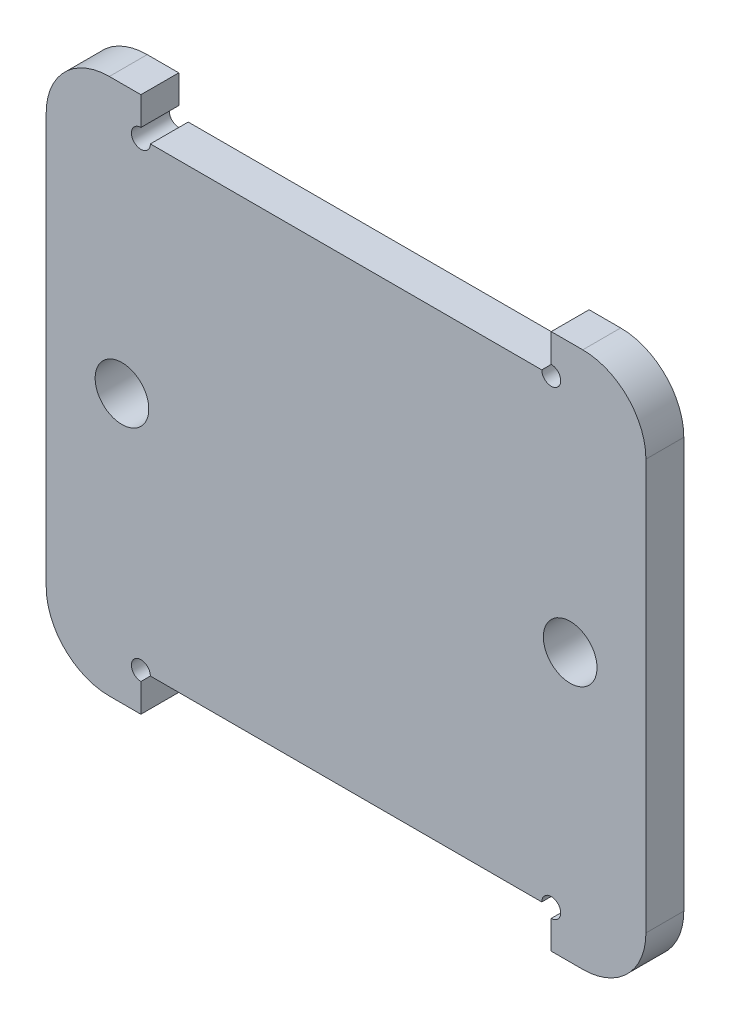
ISO-10303-21;
HEADER;
FILE_DESCRIPTION(('STEP AP214'),'2;1');
FILE_NAME('part.step','',(''),(''),'','','');
FILE_SCHEMA(('AUTOMOTIVE_DESIGN { 1 0 10303 214 1 1 1 1 }'));
ENDSEC;
DATA;
#1=APPLICATION_CONTEXT('core data for automotive mechanical design processes');
#2=APPLICATION_PROTOCOL_DEFINITION('international standard','automotive_design',2000,#1);
#3=PRODUCT_CONTEXT('',#1,'mechanical');
#4=PRODUCT('Part','Part','',(#3));
#5=PRODUCT_RELATED_PRODUCT_CATEGORY('part','',(#4));
#6=PRODUCT_DEFINITION_FORMATION('','',#4);
#7=PRODUCT_DEFINITION_CONTEXT('part definition',#1,'design');
#8=PRODUCT_DEFINITION('design','',#6,#7);
#9=PRODUCT_DEFINITION_SHAPE('','',#8);
#10=(LENGTH_UNIT() NAMED_UNIT(*) SI_UNIT(.MILLI.,.METRE.));
#11=(NAMED_UNIT(*) PLANE_ANGLE_UNIT() SI_UNIT($,.RADIAN.));
#12=(NAMED_UNIT(*) SI_UNIT($,.STERADIAN.) SOLID_ANGLE_UNIT());
#13=UNCERTAINTY_MEASURE_WITH_UNIT(LENGTH_MEASURE(1.E-05),#10,'distance_accuracy_value','');
#14=(GEOMETRIC_REPRESENTATION_CONTEXT(3) GLOBAL_UNCERTAINTY_ASSIGNED_CONTEXT((#13)) GLOBAL_UNIT_ASSIGNED_CONTEXT((#10,
#11,#12)) REPRESENTATION_CONTEXT('',''));
#15=CARTESIAN_POINT('',(0.,0.,0.));
#16=DIRECTION('',(0.,0.,1.));
#17=DIRECTION('',(1.,0.,0.));
#18=AXIS2_PLACEMENT_3D('',#15,#16,#17);
#19=CARTESIAN_POINT('',(-314.,95.,6.));
#20=DIRECTION('',(0.,0.,-1.));
#21=DIRECTION('',(-1.,0.,0.));
#22=AXIS2_PLACEMENT_3D('',#19,#20,#21);
#23=PLANE('',#22);
#24=DIRECTION('',(1.,0.,0.));
#25=VECTOR('',#24,1.);
#26=CARTESIAN_POINT('',(-319.,26.,6.));
#27=LINE('',#26,#25);
#28=CARTESIAN_POINT('',(-382.5,26.,6.));
#29=VERTEX_POINT('',#28);
#30=CARTESIAN_POINT('',(-320.5,26.,6.));
#31=VERTEX_POINT('',#30);
#32=EDGE_CURVE('E190',#29,#31,#27,.T.);
#33=ORIENTED_EDGE('',*,*,#32,.T.);
#34=CARTESIAN_POINT('',(-319.,26.,6.));
#35=DIRECTION('',(0.,0.,1.));
#36=DIRECTION('',(-1.,0.,0.));
#37=AXIS2_PLACEMENT_3D('',#34,#35,#36);
#38=CIRCLE('',#37,1.50000000000002);
#39=CARTESIAN_POINT('',(-319.,24.5,6.));
#40=VERTEX_POINT('',#39);
#41=EDGE_CURVE('E172',#40,#31,#38,.T.);
#42=ORIENTED_EDGE('',*,*,#41,.F.);
#43=DIRECTION('',(0.,-1.,0.));
#44=VECTOR('',#43,1.);
#45=CARTESIAN_POINT('',(-319.,20.,6.));
#46=LINE('',#45,#44);
#47=CARTESIAN_POINT('',(-319.,20.,6.));
#48=VERTEX_POINT('',#47);
#49=EDGE_CURVE('E202',#40,#48,#46,.T.);
#50=ORIENTED_EDGE('',*,*,#49,.T.);
#51=DIRECTION('',(1.,0.,0.));
#52=VECTOR('',#51,1.);
#53=CARTESIAN_POINT('',(-314.,20.,6.));
#54=LINE('',#53,#52);
#55=CARTESIAN_POINT('',(-314.,20.,6.));
#56=VERTEX_POINT('',#55);
#57=EDGE_CURVE('E208',#48,#56,#54,.T.);
#58=ORIENTED_EDGE('',*,*,#57,.T.);
#59=CARTESIAN_POINT('',(-314.,30.,6.));
#60=DIRECTION('',(0.,0.,1.));
#61=DIRECTION('',(-1.,0.,0.));
#62=AXIS2_PLACEMENT_3D('',#59,#60,#61);
#63=CIRCLE('',#62,10.);
#64=CARTESIAN_POINT('',(-304.,30.,6.));
#65=VERTEX_POINT('',#64);
#66=EDGE_CURVE('E217',#56,#65,#63,.T.);
#67=ORIENTED_EDGE('',*,*,#66,.T.);
#68=DIRECTION('',(0.,1.,0.));
#69=VECTOR('',#68,1.);
#70=CARTESIAN_POINT('',(-304.,95.,6.));
#71=LINE('',#70,#69);
#72=CARTESIAN_POINT('',(-304.,95.,6.));
#73=VERTEX_POINT('',#72);
#74=EDGE_CURVE('E220',#65,#73,#71,.T.);
#75=ORIENTED_EDGE('',*,*,#74,.T.);
#76=CARTESIAN_POINT('',(-314.,95.,6.));
#77=DIRECTION('',(0.,0.,1.));
#78=DIRECTION('',(-1.,0.,0.));
#79=AXIS2_PLACEMENT_3D('',#76,#77,#78);
#80=CIRCLE('',#79,10.);
#81=CARTESIAN_POINT('',(-314.,105.,6.));
#82=VERTEX_POINT('',#81);
#83=EDGE_CURVE('E223',#73,#82,#80,.T.);
#84=ORIENTED_EDGE('',*,*,#83,.T.);
#85=DIRECTION('',(-1.,0.,0.));
#86=VECTOR('',#85,1.);
#87=CARTESIAN_POINT('',(-319.,105.,6.));
#88=LINE('',#87,#86);
#89=CARTESIAN_POINT('',(-319.,105.,6.));
#90=VERTEX_POINT('',#89);
#91=EDGE_CURVE('E226',#82,#90,#88,.T.);
#92=ORIENTED_EDGE('',*,*,#91,.T.);
#93=DIRECTION('',(0.,-1.,0.));
#94=VECTOR('',#93,1.);
#95=CARTESIAN_POINT('',(-319.,99.,6.));
#96=LINE('',#95,#94);
#97=CARTESIAN_POINT('',(-319.,100.5,6.));
#98=VERTEX_POINT('',#97);
#99=EDGE_CURVE('E281',#90,#98,#96,.T.);
#100=ORIENTED_EDGE('',*,*,#99,.T.);
#101=CARTESIAN_POINT('',(-319.,99.,6.));
#102=DIRECTION('',(0.,0.,1.));
#103=DIRECTION('',(1.,0.,0.));
#104=AXIS2_PLACEMENT_3D('',#101,#102,#103);
#105=CIRCLE('',#104,1.50000000000002);
#106=CARTESIAN_POINT('',(-320.5,99.,6.));
#107=VERTEX_POINT('',#106);
#108=EDGE_CURVE('E425',#107,#98,#105,.T.);
#109=ORIENTED_EDGE('',*,*,#108,.F.);
#110=DIRECTION('',(-1.,0.,0.));
#111=VECTOR('',#110,1.);
#112=CARTESIAN_POINT('',(-384.,99.,6.));
#113=LINE('',#112,#111);
#114=CARTESIAN_POINT('',(-382.5,99.,6.));
#115=VERTEX_POINT('',#114);
#116=EDGE_CURVE('E413',#107,#115,#113,.T.);
#117=ORIENTED_EDGE('',*,*,#116,.T.);
#118=CARTESIAN_POINT('',(-384.,99.,6.));
#119=DIRECTION('',(0.,0.,1.));
#120=DIRECTION('',(-1.,0.,0.));
#121=AXIS2_PLACEMENT_3D('',#118,#119,#120);
#122=CIRCLE('',#121,1.50000000000002);
#123=CARTESIAN_POINT('',(-384.,100.5,6.));
#124=VERTEX_POINT('',#123);
#125=EDGE_CURVE('E417',#124,#115,#122,.T.);
#126=ORIENTED_EDGE('',*,*,#125,.F.);
#127=DIRECTION('',(0.,1.,0.));
#128=VECTOR('',#127,1.);
#129=CARTESIAN_POINT('',(-384.,99.,6.));
#130=LINE('',#129,#128);
#131=CARTESIAN_POINT('',(-384.,105.,6.));
#132=VERTEX_POINT('',#131);
#133=EDGE_CURVE('E340',#124,#132,#130,.T.);
#134=ORIENTED_EDGE('',*,*,#133,.T.);
#135=DIRECTION('',(-1.,0.,0.));
#136=VECTOR('',#135,1.);
#137=CARTESIAN_POINT('',(-384.,105.,6.));
#138=LINE('',#137,#136);
#139=CARTESIAN_POINT('',(-389.,105.,6.));
#140=VERTEX_POINT('',#139);
#141=EDGE_CURVE('E361',#132,#140,#138,.T.);
#142=ORIENTED_EDGE('',*,*,#141,.T.);
#143=CARTESIAN_POINT('',(-389.,95.,6.));
#144=DIRECTION('',(0.,0.,1.));
#145=DIRECTION('',(1.,0.,0.));
#146=AXIS2_PLACEMENT_3D('',#143,#144,#145);
#147=CIRCLE('',#146,10.);
#148=CARTESIAN_POINT('',(-399.,95.,6.));
#149=VERTEX_POINT('',#148);
#150=EDGE_CURVE('E357',#140,#149,#147,.T.);
#151=ORIENTED_EDGE('',*,*,#150,.T.);
#152=DIRECTION('',(0.,-1.,0.));
#153=VECTOR('',#152,1.);
#154=CARTESIAN_POINT('',(-399.,95.,6.));
#155=LINE('',#154,#153);
#156=CARTESIAN_POINT('',(-399.,30.,6.));
#157=VERTEX_POINT('',#156);
#158=EDGE_CURVE('E360',#149,#157,#155,.T.);
#159=ORIENTED_EDGE('',*,*,#158,.T.);
#160=CARTESIAN_POINT('',(-389.,30.,6.));
#161=DIRECTION('',(0.,0.,1.));
#162=DIRECTION('',(1.,0.,0.));
#163=AXIS2_PLACEMENT_3D('',#160,#161,#162);
#164=CIRCLE('',#163,10.);
#165=CARTESIAN_POINT('',(-389.,19.9999999999999,6.));
#166=VERTEX_POINT('',#165);
#167=EDGE_CURVE('E364',#157,#166,#164,.T.);
#168=ORIENTED_EDGE('',*,*,#167,.T.);
#169=DIRECTION('',(1.,0.,0.));
#170=VECTOR('',#169,1.);
#171=CARTESIAN_POINT('',(-389.,20.,6.));
#172=LINE('',#171,#170);
#173=CARTESIAN_POINT('',(-384.,20.,6.));
#174=VERTEX_POINT('',#173);
#175=EDGE_CURVE('E211',#166,#174,#172,.T.);
#176=ORIENTED_EDGE('',*,*,#175,.T.);
#177=DIRECTION('',(0.,1.,0.));
#178=VECTOR('',#177,1.);
#179=CARTESIAN_POINT('',(-384.,20.,6.));
#180=LINE('',#179,#178);
#181=CARTESIAN_POINT('',(-384.,24.5,6.));
#182=VERTEX_POINT('',#181);
#183=EDGE_CURVE('E203',#174,#182,#180,.T.);
#184=ORIENTED_EDGE('',*,*,#183,.T.);
#185=CARTESIAN_POINT('',(-384.,26.,6.));
#186=DIRECTION('',(0.,0.,1.));
#187=DIRECTION('',(1.,0.,0.));
#188=AXIS2_PLACEMENT_3D('',#185,#186,#187);
#189=CIRCLE('',#188,1.50000000000002);
#190=EDGE_CURVE('E200',#29,#182,#189,.T.);
#191=ORIENTED_EDGE('',*,*,#190,.F.);
#192=EDGE_LOOP('',(#33,#42,#50,#58,#67,#75,#84,#92,#100,#109,#117,#126,#134,#142,#151,#159,#168,
#176,#184,#191));
#193=FACE_BOUND('',#192,.T.);
#194=CARTESIAN_POINT('',(-316.,62.5,6.));
#195=DIRECTION('',(0.,0.,1.));
#196=DIRECTION('',(1.,0.,0.));
#197=AXIS2_PLACEMENT_3D('',#194,#195,#196);
#198=CIRCLE('',#197,4.24999999999995);
#199=CARTESIAN_POINT('',(-311.75,62.5,6.));
#200=VERTEX_POINT('',#199);
#201=EDGE_CURVE('E235',#200,#200,#198,.T.);
#202=ORIENTED_EDGE('',*,*,#201,.F.);
#203=EDGE_LOOP('',(#202));
#204=FACE_BOUND('',#203,.T.);
#205=CARTESIAN_POINT('',(-387.,62.5,6.));
#206=DIRECTION('',(0.,0.,1.));
#207=DIRECTION('',(-1.,0.,0.));
#208=AXIS2_PLACEMENT_3D('',#205,#206,#207);
#209=CIRCLE('',#208,4.24999999999995);
#210=CARTESIAN_POINT('',(-391.25,62.5,6.));
#211=VERTEX_POINT('',#210);
#212=EDGE_CURVE('E398',#211,#211,#209,.T.);
#213=ORIENTED_EDGE('',*,*,#212,.F.);
#214=EDGE_LOOP('',(#213));
#215=FACE_BOUND('',#214,.T.);
#216=ADVANCED_FACE('F36',(#193,#204,#215),#23,.F.);
#217=CARTESIAN_POINT('',(-314.,95.,0.));
#218=DIRECTION('',(0.,0.,-1.));
#219=DIRECTION('',(-1.,0.,0.));
#220=AXIS2_PLACEMENT_3D('',#217,#218,#219);
#221=PLANE('',#220);
#222=CARTESIAN_POINT('',(-319.,26.,0.));
#223=DIRECTION('',(0.,0.,1.));
#224=DIRECTION('',(-1.,0.,0.));
#225=AXIS2_PLACEMENT_3D('',#222,#223,#224);
#226=CIRCLE('',#225,1.50000000000002);
#227=CARTESIAN_POINT('',(-319.,24.5,0.));
#228=VERTEX_POINT('',#227);
#229=CARTESIAN_POINT('',(-320.5,26.,0.));
#230=VERTEX_POINT('',#229);
#231=EDGE_CURVE('E183',#228,#230,#226,.T.);
#232=ORIENTED_EDGE('',*,*,#231,.T.);
#233=DIRECTION('',(1.,0.,0.));
#234=VECTOR('',#233,1.);
#235=CARTESIAN_POINT('',(-319.,26.,0.));
#236=LINE('',#235,#234);
#237=CARTESIAN_POINT('',(-382.5,26.,0.));
#238=VERTEX_POINT('',#237);
#239=EDGE_CURVE('E192',#238,#230,#236,.T.);
#240=ORIENTED_EDGE('',*,*,#239,.F.);
#241=CARTESIAN_POINT('',(-384.,26.,0.));
#242=DIRECTION('',(0.,0.,1.));
#243=DIRECTION('',(1.,0.,0.));
#244=AXIS2_PLACEMENT_3D('',#241,#242,#243);
#245=CIRCLE('',#244,1.50000000000002);
#246=CARTESIAN_POINT('',(-384.,24.5,0.));
#247=VERTEX_POINT('',#246);
#248=EDGE_CURVE('E195',#238,#247,#245,.T.);
#249=ORIENTED_EDGE('',*,*,#248,.T.);
#250=DIRECTION('',(0.,1.,0.));
#251=VECTOR('',#250,1.);
#252=CARTESIAN_POINT('',(-384.,20.,0.));
#253=LINE('',#252,#251);
#254=CARTESIAN_POINT('',(-384.,20.,0.));
#255=VERTEX_POINT('',#254);
#256=EDGE_CURVE('E257',#255,#247,#253,.T.);
#257=ORIENTED_EDGE('',*,*,#256,.F.);
#258=DIRECTION('',(1.,0.,0.));
#259=VECTOR('',#258,1.);
#260=CARTESIAN_POINT('',(-389.,20.,0.));
#261=LINE('',#260,#259);
#262=CARTESIAN_POINT('',(-389.,19.9999999999999,0.));
#263=VERTEX_POINT('',#262);
#264=EDGE_CURVE('E254',#263,#255,#261,.T.);
#265=ORIENTED_EDGE('',*,*,#264,.F.);
#266=CARTESIAN_POINT('',(-389.,30.,0.));
#267=DIRECTION('',(0.,0.,1.));
#268=DIRECTION('',(1.,0.,0.));
#269=AXIS2_PLACEMENT_3D('',#266,#267,#268);
#270=CIRCLE('',#269,10.);
#271=CARTESIAN_POINT('',(-399.,30.,0.));
#272=VERTEX_POINT('',#271);
#273=EDGE_CURVE('E251',#272,#263,#270,.T.);
#274=ORIENTED_EDGE('',*,*,#273,.F.);
#275=DIRECTION('',(0.,-1.,0.));
#276=VECTOR('',#275,1.);
#277=CARTESIAN_POINT('',(-399.,95.,0.));
#278=LINE('',#277,#276);
#279=CARTESIAN_POINT('',(-399.,95.,0.));
#280=VERTEX_POINT('',#279);
#281=EDGE_CURVE('E248',#280,#272,#278,.T.);
#282=ORIENTED_EDGE('',*,*,#281,.F.);
#283=CARTESIAN_POINT('',(-389.,95.,0.));
#284=DIRECTION('',(0.,0.,1.));
#285=DIRECTION('',(1.,0.,0.));
#286=AXIS2_PLACEMENT_3D('',#283,#284,#285);
#287=CIRCLE('',#286,10.);
#288=CARTESIAN_POINT('',(-389.,105.,0.));
#289=VERTEX_POINT('',#288);
#290=EDGE_CURVE('E245',#289,#280,#287,.T.);
#291=ORIENTED_EDGE('',*,*,#290,.F.);
#292=DIRECTION('',(-1.,0.,0.));
#293=VECTOR('',#292,1.);
#294=CARTESIAN_POINT('',(-384.,105.,0.));
#295=LINE('',#294,#293);
#296=CARTESIAN_POINT('',(-384.,105.,0.));
#297=VERTEX_POINT('',#296);
#298=EDGE_CURVE('E242',#297,#289,#295,.T.);
#299=ORIENTED_EDGE('',*,*,#298,.F.);
#300=DIRECTION('',(0.,1.,0.));
#301=VECTOR('',#300,1.);
#302=CARTESIAN_POINT('',(-384.,99.,0.));
#303=LINE('',#302,#301);
#304=CARTESIAN_POINT('',(-384.,100.5,0.));
#305=VERTEX_POINT('',#304);
#306=EDGE_CURVE('E239',#305,#297,#303,.T.);
#307=ORIENTED_EDGE('',*,*,#306,.F.);
#308=CARTESIAN_POINT('',(-384.,99.,0.));
#309=DIRECTION('',(0.,0.,1.));
#310=DIRECTION('',(-1.,0.,0.));
#311=AXIS2_PLACEMENT_3D('',#308,#309,#310);
#312=CIRCLE('',#311,1.50000000000002);
#313=CARTESIAN_POINT('',(-382.5,99.,0.));
#314=VERTEX_POINT('',#313);
#315=EDGE_CURVE('E59',#305,#314,#312,.T.);
#316=ORIENTED_EDGE('',*,*,#315,.T.);
#317=DIRECTION('',(-1.,0.,0.));
#318=VECTOR('',#317,1.);
#319=CARTESIAN_POINT('',(-384.,99.,0.));
#320=LINE('',#319,#318);
#321=CARTESIAN_POINT('',(-320.5,99.,0.));
#322=VERTEX_POINT('',#321);
#323=EDGE_CURVE('E234',#322,#314,#320,.T.);
#324=ORIENTED_EDGE('',*,*,#323,.F.);
#325=CARTESIAN_POINT('',(-319.,99.,0.));
#326=DIRECTION('',(0.,0.,1.));
#327=DIRECTION('',(1.,0.,0.));
#328=AXIS2_PLACEMENT_3D('',#325,#326,#327);
#329=CIRCLE('',#328,1.50000000000002);
#330=CARTESIAN_POINT('',(-319.,100.5,0.));
#331=VERTEX_POINT('',#330);
#332=EDGE_CURVE('E52',#322,#331,#329,.T.);
#333=ORIENTED_EDGE('',*,*,#332,.T.);
#334=DIRECTION('',(0.,-1.,0.));
#335=VECTOR('',#334,1.);
#336=CARTESIAN_POINT('',(-319.,99.,0.));
#337=LINE('',#336,#335);
#338=CARTESIAN_POINT('',(-319.,105.,0.));
#339=VERTEX_POINT('',#338);
#340=EDGE_CURVE('E230',#339,#331,#337,.T.);
#341=ORIENTED_EDGE('',*,*,#340,.F.);
#342=DIRECTION('',(-1.,0.,0.));
#343=VECTOR('',#342,1.);
#344=CARTESIAN_POINT('',(-319.,105.,0.));
#345=LINE('',#344,#343);
#346=CARTESIAN_POINT('',(-314.,105.,0.));
#347=VERTEX_POINT('',#346);
#348=EDGE_CURVE('E278',#347,#339,#345,.T.);
#349=ORIENTED_EDGE('',*,*,#348,.F.);
#350=CARTESIAN_POINT('',(-314.,95.,0.));
#351=DIRECTION('',(0.,0.,1.));
#352=DIRECTION('',(-1.,0.,0.));
#353=AXIS2_PLACEMENT_3D('',#350,#351,#352);
#354=CIRCLE('',#353,10.);
#355=CARTESIAN_POINT('',(-304.,95.,0.));
#356=VERTEX_POINT('',#355);
#357=EDGE_CURVE('E275',#356,#347,#354,.T.);
#358=ORIENTED_EDGE('',*,*,#357,.F.);
#359=DIRECTION('',(0.,1.,0.));
#360=VECTOR('',#359,1.);
#361=CARTESIAN_POINT('',(-304.,95.,0.));
#362=LINE('',#361,#360);
#363=CARTESIAN_POINT('',(-304.,30.,0.));
#364=VERTEX_POINT('',#363);
#365=EDGE_CURVE('E272',#364,#356,#362,.T.);
#366=ORIENTED_EDGE('',*,*,#365,.F.);
#367=CARTESIAN_POINT('',(-314.,30.,0.));
#368=DIRECTION('',(0.,0.,1.));
#369=DIRECTION('',(-1.,0.,0.));
#370=AXIS2_PLACEMENT_3D('',#367,#368,#369);
#371=CIRCLE('',#370,10.);
#372=CARTESIAN_POINT('',(-314.,20.,0.));
#373=VERTEX_POINT('',#372);
#374=EDGE_CURVE('E269',#373,#364,#371,.T.);
#375=ORIENTED_EDGE('',*,*,#374,.F.);
#376=DIRECTION('',(1.,0.,0.));
#377=VECTOR('',#376,1.);
#378=CARTESIAN_POINT('',(-314.,20.,0.));
#379=LINE('',#378,#377);
#380=CARTESIAN_POINT('',(-319.,20.,0.));
#381=VERTEX_POINT('',#380);
#382=EDGE_CURVE('E266',#381,#373,#379,.T.);
#383=ORIENTED_EDGE('',*,*,#382,.F.);
#384=DIRECTION('',(0.,-1.,0.));
#385=VECTOR('',#384,1.);
#386=CARTESIAN_POINT('',(-319.,20.,0.));
#387=LINE('',#386,#385);
#388=EDGE_CURVE('E263',#228,#381,#387,.T.);
#389=ORIENTED_EDGE('',*,*,#388,.F.);
#390=EDGE_LOOP('',(#232,#240,#249,#257,#265,#274,#282,#291,#299,#307,#316,#324,#333,#341,#349,
#358,#366,#375,#383,#389));
#391=FACE_BOUND('',#390,.T.);
#392=CARTESIAN_POINT('',(-316.,62.5,0.));
#393=DIRECTION('',(0.,0.,1.));
#394=DIRECTION('',(1.,0.,0.));
#395=AXIS2_PLACEMENT_3D('',#392,#393,#394);
#396=CIRCLE('',#395,4.24999999999995);
#397=CARTESIAN_POINT('',(-311.75,62.5,0.));
#398=VERTEX_POINT('',#397);
#399=EDGE_CURVE('E401',#398,#398,#396,.T.);
#400=ORIENTED_EDGE('',*,*,#399,.T.);
#401=EDGE_LOOP('',(#400));
#402=FACE_BOUND('',#401,.T.);
#403=CARTESIAN_POINT('',(-387.,62.5,0.));
#404=DIRECTION('',(0.,0.,1.));
#405=DIRECTION('',(-1.,0.,0.));
#406=AXIS2_PLACEMENT_3D('',#403,#404,#405);
#407=CIRCLE('',#406,4.24999999999995);
#408=CARTESIAN_POINT('',(-391.25,62.5,0.));
#409=VERTEX_POINT('',#408);
#410=EDGE_CURVE('E397',#409,#409,#407,.T.);
#411=ORIENTED_EDGE('',*,*,#410,.T.);
#412=EDGE_LOOP('',(#411));
#413=FACE_BOUND('',#412,.T.);
#414=ADVANCED_FACE('F344',(#391,#402,#413),#221,.T.);
#415=CARTESIAN_POINT('',(-319.,99.,6.));
#416=DIRECTION('',(1.,0.,0.));
#417=DIRECTION('',(0.,0.,-1.));
#418=AXIS2_PLACEMENT_3D('',#415,#416,#417);
#419=PLANE('',#418);
#420=ORIENTED_EDGE('',*,*,#340,.T.);
#421=DIRECTION('',(0.,0.,1.));
#422=VECTOR('',#421,1.);
#423=CARTESIAN_POINT('',(-319.,100.5,0.));
#424=LINE('',#423,#422);
#425=EDGE_CURVE('E391',#331,#98,#424,.T.);
#426=ORIENTED_EDGE('',*,*,#425,.T.);
#427=ORIENTED_EDGE('',*,*,#99,.F.);
#428=DIRECTION('',(0.,0.,-1.));
#429=VECTOR('',#428,1.);
#430=CARTESIAN_POINT('',(-319.,105.,6.));
#431=LINE('',#430,#429);
#432=EDGE_CURVE('E229',#90,#339,#431,.T.);
#433=ORIENTED_EDGE('',*,*,#432,.T.);
#434=EDGE_LOOP('',(#420,#426,#427,#433));
#435=FACE_BOUND('',#434,.T.);
#436=ADVANCED_FACE('F38',(#435),#419,.F.);
#437=CARTESIAN_POINT('',(-384.,99.,6.));
#438=DIRECTION('',(0.,-1.,0.));
#439=DIRECTION('',(0.,0.,-1.));
#440=AXIS2_PLACEMENT_3D('',#437,#438,#439);
#441=PLANE('',#440);
#442=ORIENTED_EDGE('',*,*,#323,.T.);
#443=DIRECTION('',(0.,0.,1.));
#444=VECTOR('',#443,1.);
#445=CARTESIAN_POINT('',(-382.5,99.,0.));
#446=LINE('',#445,#444);
#447=EDGE_CURVE('E388',#314,#115,#446,.T.);
#448=ORIENTED_EDGE('',*,*,#447,.T.);
#449=ORIENTED_EDGE('',*,*,#116,.F.);
#450=DIRECTION('',(0.,0.,1.));
#451=VECTOR('',#450,1.);
#452=CARTESIAN_POINT('',(-320.5,99.,0.));
#453=LINE('',#452,#451);
#454=EDGE_CURVE('E11',#107,#322,#453,.F.);
#455=ORIENTED_EDGE('',*,*,#454,.T.);
#456=EDGE_LOOP('',(#442,#448,#449,#455));
#457=FACE_BOUND('',#456,.T.);
#458=ADVANCED_FACE('F448',(#457),#441,.F.);
#459=CARTESIAN_POINT('',(-384.,99.,6.));
#460=DIRECTION('',(-1.,0.,0.));
#461=DIRECTION('',(0.,0.,1.));
#462=AXIS2_PLACEMENT_3D('',#459,#460,#461);
#463=PLANE('',#462);
#464=ORIENTED_EDGE('',*,*,#133,.F.);
#465=DIRECTION('',(0.,0.,1.));
#466=VECTOR('',#465,1.);
#467=CARTESIAN_POINT('',(-384.,100.5,0.));
#468=LINE('',#467,#466);
#469=EDGE_CURVE('E45',#124,#305,#468,.F.);
#470=ORIENTED_EDGE('',*,*,#469,.T.);
#471=ORIENTED_EDGE('',*,*,#306,.T.);
#472=DIRECTION('',(0.,0.,-1.));
#473=VECTOR('',#472,1.);
#474=CARTESIAN_POINT('',(-384.,105.,6.));
#475=LINE('',#474,#473);
#476=EDGE_CURVE('E324',#132,#297,#475,.T.);
#477=ORIENTED_EDGE('',*,*,#476,.F.);
#478=EDGE_LOOP('',(#464,#470,#471,#477));
#479=FACE_BOUND('',#478,.T.);
#480=ADVANCED_FACE('F338',(#479),#463,.F.);
#481=CARTESIAN_POINT('',(-384.,105.,6.));
#482=DIRECTION('',(0.,-1.,0.));
#483=DIRECTION('',(0.,0.,-1.));
#484=AXIS2_PLACEMENT_3D('',#481,#482,#483);
#485=PLANE('',#484);
#486=ORIENTED_EDGE('',*,*,#298,.T.);
#487=DIRECTION('',(0.,0.,-1.));
#488=VECTOR('',#487,1.);
#489=CARTESIAN_POINT('',(-389.,105.,6.));
#490=LINE('',#489,#488);
#491=EDGE_CURVE('E320',#140,#289,#490,.T.);
#492=ORIENTED_EDGE('',*,*,#491,.F.);
#493=ORIENTED_EDGE('',*,*,#141,.F.);
#494=ORIENTED_EDGE('',*,*,#476,.T.);
#495=EDGE_LOOP('',(#486,#492,#493,#494));
#496=FACE_BOUND('',#495,.T.);
#497=ADVANCED_FACE('F351',(#496),#485,.F.);
#498=CARTESIAN_POINT('',(-389.,95.,6.));
#499=DIRECTION('',(0.,0.,-1.));
#500=DIRECTION('',(-1.,0.,0.));
#501=AXIS2_PLACEMENT_3D('',#498,#499,#500);
#502=CYLINDRICAL_SURFACE('',#501,10.);
#503=ORIENTED_EDGE('',*,*,#290,.T.);
#504=DIRECTION('',(0.,0.,-1.));
#505=VECTOR('',#504,1.);
#506=CARTESIAN_POINT('',(-399.,95.,6.));
#507=LINE('',#506,#505);
#508=EDGE_CURVE('E316',#149,#280,#507,.T.);
#509=ORIENTED_EDGE('',*,*,#508,.F.);
#510=ORIENTED_EDGE('',*,*,#150,.F.);
#511=ORIENTED_EDGE('',*,*,#491,.T.);
#512=EDGE_LOOP('',(#503,#509,#510,#511));
#513=FACE_BOUND('',#512,.T.);
#514=ADVANCED_FACE('F355',(#513),#502,.T.);
#515=CARTESIAN_POINT('',(-399.,95.,6.));
#516=DIRECTION('',(1.,0.,0.));
#517=DIRECTION('',(0.,0.,-1.));
#518=AXIS2_PLACEMENT_3D('',#515,#516,#517);
#519=PLANE('',#518);
#520=ORIENTED_EDGE('',*,*,#281,.T.);
#521=DIRECTION('',(0.,0.,-1.));
#522=VECTOR('',#521,1.);
#523=CARTESIAN_POINT('',(-399.,30.,6.));
#524=LINE('',#523,#522);
#525=EDGE_CURVE('E312',#157,#272,#524,.T.);
#526=ORIENTED_EDGE('',*,*,#525,.F.);
#527=ORIENTED_EDGE('',*,*,#158,.F.);
#528=ORIENTED_EDGE('',*,*,#508,.T.);
#529=EDGE_LOOP('',(#520,#526,#527,#528));
#530=FACE_BOUND('',#529,.T.);
#531=ADVANCED_FACE('F501',(#530),#519,.F.);
#532=CARTESIAN_POINT('',(-389.,30.,6.));
#533=DIRECTION('',(0.,0.,-1.));
#534=DIRECTION('',(-1.,0.,0.));
#535=AXIS2_PLACEMENT_3D('',#532,#533,#534);
#536=CYLINDRICAL_SURFACE('',#535,10.);
#537=ORIENTED_EDGE('',*,*,#273,.T.);
#538=DIRECTION('',(0.,0.,-1.));
#539=VECTOR('',#538,1.);
#540=CARTESIAN_POINT('',(-389.,19.9999999999999,6.));
#541=LINE('',#540,#539);
#542=EDGE_CURVE('E308',#166,#263,#541,.T.);
#543=ORIENTED_EDGE('',*,*,#542,.F.);
#544=ORIENTED_EDGE('',*,*,#167,.F.);
#545=ORIENTED_EDGE('',*,*,#525,.T.);
#546=EDGE_LOOP('',(#537,#543,#544,#545));
#547=FACE_BOUND('',#546,.T.);
#548=ADVANCED_FACE('F498',(#547),#536,.T.);
#549=CARTESIAN_POINT('',(-389.,20.,6.));
#550=DIRECTION('',(0.,1.,0.));
#551=DIRECTION('',(-1.,0.,0.));
#552=AXIS2_PLACEMENT_3D('',#549,#550,#551);
#553=PLANE('',#552);
#554=ORIENTED_EDGE('',*,*,#264,.T.);
#555=DIRECTION('',(0.,0.,-1.));
#556=VECTOR('',#555,1.);
#557=CARTESIAN_POINT('',(-384.,20.,6.));
#558=LINE('',#557,#556);
#559=EDGE_CURVE('E304',#174,#255,#558,.T.);
#560=ORIENTED_EDGE('',*,*,#559,.F.);
#561=ORIENTED_EDGE('',*,*,#175,.F.);
#562=ORIENTED_EDGE('',*,*,#542,.T.);
#563=EDGE_LOOP('',(#554,#560,#561,#562));
#564=FACE_BOUND('',#563,.T.);
#565=ADVANCED_FACE('F379',(#564),#553,.F.);
#566=CARTESIAN_POINT('',(-384.,20.,6.));
#567=DIRECTION('',(-1.,0.,0.));
#568=DIRECTION('',(0.,0.,1.));
#569=AXIS2_PLACEMENT_3D('',#566,#567,#568);
#570=PLANE('',#569);
#571=ORIENTED_EDGE('',*,*,#256,.T.);
#572=DIRECTION('',(0.,0.,1.));
#573=VECTOR('',#572,1.);
#574=CARTESIAN_POINT('',(-384.,24.5,0.));
#575=LINE('',#574,#573);
#576=EDGE_CURVE('E194',#247,#182,#575,.T.);
#577=ORIENTED_EDGE('',*,*,#576,.T.);
#578=ORIENTED_EDGE('',*,*,#183,.F.);
#579=ORIENTED_EDGE('',*,*,#559,.T.);
#580=EDGE_LOOP('',(#571,#577,#578,#579));
#581=FACE_BOUND('',#580,.T.);
#582=ADVANCED_FACE('F384',(#581),#570,.F.);
#583=CARTESIAN_POINT('',(-319.,26.,6.));
#584=DIRECTION('',(0.,1.,0.));
#585=DIRECTION('',(-1.,0.,0.));
#586=AXIS2_PLACEMENT_3D('',#583,#584,#585);
#587=PLANE('',#586);
#588=ORIENTED_EDGE('',*,*,#239,.T.);
#589=DIRECTION('',(0.,0.,1.));
#590=VECTOR('',#589,1.);
#591=CARTESIAN_POINT('',(-320.5,26.,0.));
#592=LINE('',#591,#590);
#593=EDGE_CURVE('E175',#230,#31,#592,.T.);
#594=ORIENTED_EDGE('',*,*,#593,.T.);
#595=ORIENTED_EDGE('',*,*,#32,.F.);
#596=DIRECTION('',(0.,0.,1.));
#597=VECTOR('',#596,1.);
#598=CARTESIAN_POINT('',(-382.5,26.,0.));
#599=LINE('',#598,#597);
#600=EDGE_CURVE('E330',#29,#238,#599,.F.);
#601=ORIENTED_EDGE('',*,*,#600,.T.);
#602=EDGE_LOOP('',(#588,#594,#595,#601));
#603=FACE_BOUND('',#602,.T.);
#604=ADVANCED_FACE('F188',(#603),#587,.F.);
#605=CARTESIAN_POINT('',(-319.,20.,6.));
#606=DIRECTION('',(1.,0.,0.));
#607=DIRECTION('',(0.,0.,-1.));
#608=AXIS2_PLACEMENT_3D('',#605,#606,#607);
#609=PLANE('',#608);
#610=ORIENTED_EDGE('',*,*,#49,.F.);
#611=DIRECTION('',(0.,0.,1.));
#612=VECTOR('',#611,1.);
#613=CARTESIAN_POINT('',(-319.,24.5,0.));
#614=LINE('',#613,#612);
#615=EDGE_CURVE('E178',#40,#228,#614,.F.);
#616=ORIENTED_EDGE('',*,*,#615,.T.);
#617=ORIENTED_EDGE('',*,*,#388,.T.);
#618=DIRECTION('',(0.,0.,-1.));
#619=VECTOR('',#618,1.);
#620=CARTESIAN_POINT('',(-319.,20.,6.));
#621=LINE('',#620,#619);
#622=EDGE_CURVE('E300',#48,#381,#621,.T.);
#623=ORIENTED_EDGE('',*,*,#622,.F.);
#624=EDGE_LOOP('',(#610,#616,#617,#623));
#625=FACE_BOUND('',#624,.T.);
#626=ADVANCED_FACE('F487',(#625),#609,.F.);
#627=CARTESIAN_POINT('',(-314.,20.,6.));
#628=DIRECTION('',(0.,1.,0.));
#629=DIRECTION('',(0.,0.,1.));
#630=AXIS2_PLACEMENT_3D('',#627,#628,#629);
#631=PLANE('',#630);
#632=ORIENTED_EDGE('',*,*,#382,.T.);
#633=DIRECTION('',(0.,0.,-1.));
#634=VECTOR('',#633,1.);
#635=CARTESIAN_POINT('',(-314.,20.,6.));
#636=LINE('',#635,#634);
#637=EDGE_CURVE('E296',#56,#373,#636,.T.);
#638=ORIENTED_EDGE('',*,*,#637,.F.);
#639=ORIENTED_EDGE('',*,*,#57,.F.);
#640=ORIENTED_EDGE('',*,*,#622,.T.);
#641=EDGE_LOOP('',(#632,#638,#639,#640));
#642=FACE_BOUND('',#641,.T.);
#643=ADVANCED_FACE('F483',(#642),#631,.F.);
#644=CARTESIAN_POINT('',(-314.,30.,6.));
#645=DIRECTION('',(0.,0.,-1.));
#646=DIRECTION('',(-1.,0.,0.));
#647=AXIS2_PLACEMENT_3D('',#644,#645,#646);
#648=CYLINDRICAL_SURFACE('',#647,10.);
#649=ORIENTED_EDGE('',*,*,#374,.T.);
#650=DIRECTION('',(0.,0.,-1.));
#651=VECTOR('',#650,1.);
#652=CARTESIAN_POINT('',(-304.,30.,6.));
#653=LINE('',#652,#651);
#654=EDGE_CURVE('E292',#65,#364,#653,.T.);
#655=ORIENTED_EDGE('',*,*,#654,.F.);
#656=ORIENTED_EDGE('',*,*,#66,.F.);
#657=ORIENTED_EDGE('',*,*,#637,.T.);
#658=EDGE_LOOP('',(#649,#655,#656,#657));
#659=FACE_BOUND('',#658,.T.);
#660=ADVANCED_FACE('F479',(#659),#648,.T.);
#661=CARTESIAN_POINT('',(-304.,95.,6.));
#662=DIRECTION('',(-1.,0.,0.));
#663=DIRECTION('',(0.,0.,1.));
#664=AXIS2_PLACEMENT_3D('',#661,#662,#663);
#665=PLANE('',#664);
#666=ORIENTED_EDGE('',*,*,#365,.T.);
#667=DIRECTION('',(0.,0.,-1.));
#668=VECTOR('',#667,1.);
#669=CARTESIAN_POINT('',(-304.,95.,6.));
#670=LINE('',#669,#668);
#671=EDGE_CURVE('E289',#73,#356,#670,.T.);
#672=ORIENTED_EDGE('',*,*,#671,.F.);
#673=ORIENTED_EDGE('',*,*,#74,.F.);
#674=ORIENTED_EDGE('',*,*,#654,.T.);
#675=EDGE_LOOP('',(#666,#672,#673,#674));
#676=FACE_BOUND('',#675,.T.);
#677=ADVANCED_FACE('F475',(#676),#665,.F.);
#678=CARTESIAN_POINT('',(-314.,95.,6.));
#679=DIRECTION('',(0.,0.,-1.));
#680=DIRECTION('',(-1.,0.,0.));
#681=AXIS2_PLACEMENT_3D('',#678,#679,#680);
#682=CYLINDRICAL_SURFACE('',#681,10.);
#683=ORIENTED_EDGE('',*,*,#357,.T.);
#684=DIRECTION('',(0.,0.,-1.));
#685=VECTOR('',#684,1.);
#686=CARTESIAN_POINT('',(-314.,105.,6.));
#687=LINE('',#686,#685);
#688=EDGE_CURVE('E285',#82,#347,#687,.T.);
#689=ORIENTED_EDGE('',*,*,#688,.F.);
#690=ORIENTED_EDGE('',*,*,#83,.F.);
#691=ORIENTED_EDGE('',*,*,#671,.T.);
#692=EDGE_LOOP('',(#683,#689,#690,#691));
#693=FACE_BOUND('',#692,.T.);
#694=ADVANCED_FACE('F472',(#693),#682,.T.);
#695=CARTESIAN_POINT('',(-319.,105.,6.));
#696=DIRECTION('',(0.,-1.,0.));
#697=DIRECTION('',(0.,0.,-1.));
#698=AXIS2_PLACEMENT_3D('',#695,#696,#697);
#699=PLANE('',#698);
#700=ORIENTED_EDGE('',*,*,#348,.T.);
#701=ORIENTED_EDGE('',*,*,#432,.F.);
#702=ORIENTED_EDGE('',*,*,#91,.F.);
#703=ORIENTED_EDGE('',*,*,#688,.T.);
#704=EDGE_LOOP('',(#700,#701,#702,#703));
#705=FACE_BOUND('',#704,.T.);
#706=ADVANCED_FACE('F444',(#705),#699,.F.);
#707=CARTESIAN_POINT('',(-316.,62.5,6.));
#708=DIRECTION('',(0.,0.,-1.));
#709=DIRECTION('',(-1.,0.,0.));
#710=AXIS2_PLACEMENT_3D('',#707,#708,#709);
#711=CYLINDRICAL_SURFACE('',#710,4.24999999999995);
#712=ORIENTED_EDGE('',*,*,#201,.T.);
#713=EDGE_LOOP('',(#712));
#714=FACE_BOUND('',#713,.T.);
#715=ORIENTED_EDGE('',*,*,#399,.F.);
#716=EDGE_LOOP('',(#715));
#717=FACE_BOUND('',#716,.T.);
#718=ADVANCED_FACE('F467',(#714,#717),#711,.F.);
#719=CARTESIAN_POINT('',(-387.,62.5,6.));
#720=DIRECTION('',(0.,0.,-1.));
#721=DIRECTION('',(-1.,0.,0.));
#722=AXIS2_PLACEMENT_3D('',#719,#720,#721);
#723=CYLINDRICAL_SURFACE('',#722,4.24999999999995);
#724=ORIENTED_EDGE('',*,*,#212,.T.);
#725=EDGE_LOOP('',(#724));
#726=FACE_BOUND('',#725,.T.);
#727=ORIENTED_EDGE('',*,*,#410,.F.);
#728=EDGE_LOOP('',(#727));
#729=FACE_BOUND('',#728,.T.);
#730=ADVANCED_FACE('F529',(#726,#729),#723,.F.);
#731=CARTESIAN_POINT('',(-319.,26.,0.));
#732=DIRECTION('',(0.,0.,1.));
#733=DIRECTION('',(1.,0.,0.));
#734=AXIS2_PLACEMENT_3D('',#731,#732,#733);
#735=CYLINDRICAL_SURFACE('',#734,1.50000000000002);
#736=ORIENTED_EDGE('',*,*,#231,.F.);
#737=ORIENTED_EDGE('',*,*,#615,.F.);
#738=ORIENTED_EDGE('',*,*,#41,.T.);
#739=ORIENTED_EDGE('',*,*,#593,.F.);
#740=EDGE_LOOP('',(#736,#737,#738,#739));
#741=FACE_BOUND('',#740,.T.);
#742=ADVANCED_FACE('F174',(#741),#735,.F.);
#743=CARTESIAN_POINT('',(-384.,26.,0.));
#744=DIRECTION('',(0.,0.,1.));
#745=DIRECTION('',(1.,0.,0.));
#746=AXIS2_PLACEMENT_3D('',#743,#744,#745);
#747=CYLINDRICAL_SURFACE('',#746,1.50000000000002);
#748=ORIENTED_EDGE('',*,*,#248,.F.);
#749=ORIENTED_EDGE('',*,*,#600,.F.);
#750=ORIENTED_EDGE('',*,*,#190,.T.);
#751=ORIENTED_EDGE('',*,*,#576,.F.);
#752=EDGE_LOOP('',(#748,#749,#750,#751));
#753=FACE_BOUND('',#752,.T.);
#754=ADVANCED_FACE('F451',(#753),#747,.F.);
#755=CARTESIAN_POINT('',(-384.,99.,0.));
#756=DIRECTION('',(0.,0.,1.));
#757=DIRECTION('',(1.,0.,0.));
#758=AXIS2_PLACEMENT_3D('',#755,#756,#757);
#759=CYLINDRICAL_SURFACE('',#758,1.50000000000002);
#760=ORIENTED_EDGE('',*,*,#315,.F.);
#761=ORIENTED_EDGE('',*,*,#469,.F.);
#762=ORIENTED_EDGE('',*,*,#125,.T.);
#763=ORIENTED_EDGE('',*,*,#447,.F.);
#764=EDGE_LOOP('',(#760,#761,#762,#763));
#765=FACE_BOUND('',#764,.T.);
#766=ADVANCED_FACE('F449',(#765),#759,.F.);
#767=CARTESIAN_POINT('',(-319.,99.,0.));
#768=DIRECTION('',(0.,0.,1.));
#769=DIRECTION('',(1.,0.,0.));
#770=AXIS2_PLACEMENT_3D('',#767,#768,#769);
#771=CYLINDRICAL_SURFACE('',#770,1.50000000000002);
#772=ORIENTED_EDGE('',*,*,#332,.F.);
#773=ORIENTED_EDGE('',*,*,#454,.F.);
#774=ORIENTED_EDGE('',*,*,#108,.T.);
#775=ORIENTED_EDGE('',*,*,#425,.F.);
#776=EDGE_LOOP('',(#772,#773,#774,#775));
#777=FACE_BOUND('',#776,.T.);
#778=ADVANCED_FACE('F435',(#777),#771,.F.);
#779=CLOSED_SHELL('',(#216,#414,#436,#458,#480,#497,#514,#531,#548,#565,#582,#604,#626,#643,
#660,#677,#694,#706,#718,#730,#742,#754,#766,#778));
#780=MANIFOLD_SOLID_BREP('B2',#779);
#781=ADVANCED_BREP_SHAPE_REPRESENTATION('',(#18,#780),#14);
#782=SHAPE_DEFINITION_REPRESENTATION(#9,#781);
ENDSEC;
END-ISO-10303-21;
